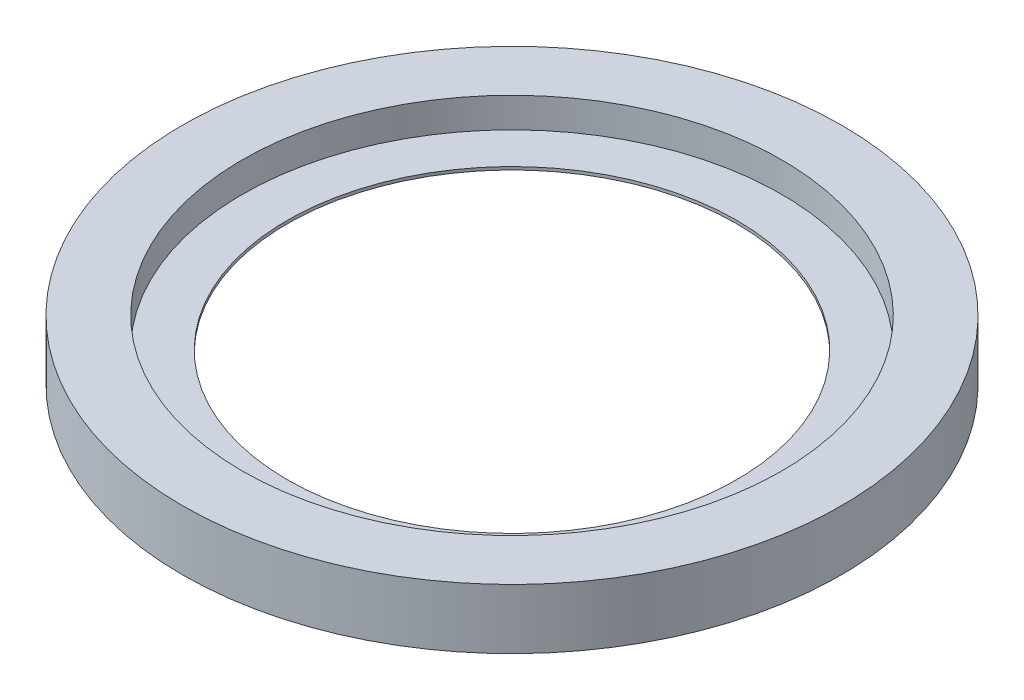
ISO-10303-21;
HEADER;
FILE_DESCRIPTION(('STEP AP214'),'2;1');
FILE_NAME('part.step','',(''),(''),'','','');
FILE_SCHEMA(('AUTOMOTIVE_DESIGN { 1 0 10303 214 1 1 1 1 }'));
ENDSEC;
DATA;
#1=APPLICATION_CONTEXT('core data for automotive mechanical design processes');
#2=APPLICATION_PROTOCOL_DEFINITION('international standard','automotive_design',2000,#1);
#3=PRODUCT_CONTEXT('',#1,'mechanical');
#4=PRODUCT('Part','Part','',(#3));
#5=PRODUCT_RELATED_PRODUCT_CATEGORY('part','',(#4));
#6=PRODUCT_DEFINITION_FORMATION('','',#4);
#7=PRODUCT_DEFINITION_CONTEXT('part definition',#1,'design');
#8=PRODUCT_DEFINITION('design','',#6,#7);
#9=PRODUCT_DEFINITION_SHAPE('','',#8);
#10=(LENGTH_UNIT() NAMED_UNIT(*) SI_UNIT(.MILLI.,.METRE.));
#11=(NAMED_UNIT(*) PLANE_ANGLE_UNIT() SI_UNIT($,.RADIAN.));
#12=(NAMED_UNIT(*) SI_UNIT($,.STERADIAN.) SOLID_ANGLE_UNIT());
#13=UNCERTAINTY_MEASURE_WITH_UNIT(LENGTH_MEASURE(1.E-05),#10,'distance_accuracy_value','');
#14=(GEOMETRIC_REPRESENTATION_CONTEXT(3) GLOBAL_UNCERTAINTY_ASSIGNED_CONTEXT((#13)) GLOBAL_UNIT_ASSIGNED_CONTEXT((#10,
#11,#12)) REPRESENTATION_CONTEXT('',''));
#15=CARTESIAN_POINT('',(0.,0.,0.));
#16=DIRECTION('',(0.,0.,1.));
#17=DIRECTION('',(1.,0.,0.));
#18=AXIS2_PLACEMENT_3D('',#15,#16,#17);
#19=CARTESIAN_POINT('',(0.,2.,0.));
#20=DIRECTION('',(0.,-1.,0.));
#21=DIRECTION('',(0.,0.,-1.));
#22=AXIS2_PLACEMENT_3D('',#19,#20,#21);
#23=CYLINDRICAL_SURFACE('',#22,9.);
#24=CARTESIAN_POINT('',(0.,0.,0.));
#25=DIRECTION('',(0.,1.,0.));
#26=DIRECTION('',(0.,0.,1.));
#27=AXIS2_PLACEMENT_3D('',#24,#25,#26);
#28=CIRCLE('',#27,9.);
#29=CARTESIAN_POINT('',(0.,0.,9.));
#30=VERTEX_POINT('',#29);
#31=EDGE_CURVE('E62',#30,#30,#28,.T.);
#32=ORIENTED_EDGE('',*,*,#31,.F.);
#33=EDGE_LOOP('',(#32));
#34=FACE_BOUND('',#33,.T.);
#35=CARTESIAN_POINT('',(0.,0.9,0.));
#36=DIRECTION('',(0.,1.,0.));
#37=DIRECTION('',(0.,0.,1.));
#38=AXIS2_PLACEMENT_3D('',#35,#36,#37);
#39=CIRCLE('',#38,9.);
#40=CARTESIAN_POINT('',(0.,0.9,9.));
#41=VERTEX_POINT('',#40);
#42=EDGE_CURVE('E66',#41,#41,#39,.T.);
#43=ORIENTED_EDGE('',*,*,#42,.T.);
#44=EDGE_LOOP('',(#43));
#45=FACE_BOUND('',#44,.T.);
#46=ADVANCED_FACE('F41',(#34,#45),#23,.F.);
#47=CARTESIAN_POINT('',(0.,2.,0.));
#48=DIRECTION('',(0.,1.,0.));
#49=DIRECTION('',(0.,0.,1.));
#50=AXIS2_PLACEMENT_3D('',#47,#48,#49);
#51=PLANE('',#50);
#52=CARTESIAN_POINT('',(0.,2.,0.));
#53=DIRECTION('',(0.,1.,0.));
#54=DIRECTION('',(0.,0.,1.));
#55=AXIS2_PLACEMENT_3D('',#52,#53,#54);
#56=CIRCLE('',#55,11.);
#57=CARTESIAN_POINT('',(0.,2.,11.));
#58=VERTEX_POINT('',#57);
#59=EDGE_CURVE('E49',#58,#58,#56,.T.);
#60=ORIENTED_EDGE('',*,*,#59,.T.);
#61=EDGE_LOOP('',(#60));
#62=FACE_BOUND('',#61,.T.);
#63=CARTESIAN_POINT('',(0.,2.,0.));
#64=DIRECTION('',(0.,1.,0.));
#65=DIRECTION('',(0.,0.,1.));
#66=AXIS2_PLACEMENT_3D('',#63,#64,#65);
#67=CIRCLE('',#66,9.);
#68=CARTESIAN_POINT('',(0.,2.,9.));
#69=VERTEX_POINT('',#68);
#70=EDGE_CURVE('E60',#69,#69,#67,.T.);
#71=ORIENTED_EDGE('',*,*,#70,.F.);
#72=EDGE_LOOP('',(#71));
#73=FACE_BOUND('',#72,.T.);
#74=ADVANCED_FACE('F101',(#62,#73),#51,.T.);
#75=CARTESIAN_POINT('',(0.,0.,0.));
#76=DIRECTION('',(0.,1.,0.));
#77=DIRECTION('',(0.,0.,1.));
#78=AXIS2_PLACEMENT_3D('',#75,#76,#77);
#79=PLANE('',#78);
#80=CARTESIAN_POINT('',(0.,0.,0.));
#81=DIRECTION('',(0.,1.,0.));
#82=DIRECTION('',(0.,0.,1.));
#83=AXIS2_PLACEMENT_3D('',#80,#81,#82);
#84=CIRCLE('',#83,11.);
#85=CARTESIAN_POINT('',(0.,0.,11.));
#86=VERTEX_POINT('',#85);
#87=EDGE_CURVE('E54',#86,#86,#84,.T.);
#88=ORIENTED_EDGE('',*,*,#87,.F.);
#89=EDGE_LOOP('',(#88));
#90=FACE_BOUND('',#89,.T.);
#91=ORIENTED_EDGE('',*,*,#31,.T.);
#92=EDGE_LOOP('',(#91));
#93=FACE_BOUND('',#92,.T.);
#94=ADVANCED_FACE('F106',(#90,#93),#79,.F.);
#95=CARTESIAN_POINT('',(0.,2.,0.));
#96=DIRECTION('',(0.,-1.,0.));
#97=DIRECTION('',(0.,0.,-1.));
#98=AXIS2_PLACEMENT_3D('',#95,#96,#97);
#99=CYLINDRICAL_SURFACE('',#98,11.);
#100=ORIENTED_EDGE('',*,*,#59,.F.);
#101=EDGE_LOOP('',(#100));
#102=FACE_BOUND('',#101,.T.);
#103=ORIENTED_EDGE('',*,*,#87,.T.);
#104=EDGE_LOOP('',(#103));
#105=FACE_BOUND('',#104,.T.);
#106=ADVANCED_FACE('F43',(#102,#105),#99,.T.);
#107=CARTESIAN_POINT('',(0.,1.,0.));
#108=DIRECTION('',(0.,1.,0.));
#109=DIRECTION('',(0.,0.,1.));
#110=AXIS2_PLACEMENT_3D('',#107,#108,#109);
#111=CIRCLE('',#110,9.);
#112=CARTESIAN_POINT('',(0.,1.,9.));
#113=VERTEX_POINT('',#112);
#114=EDGE_CURVE('E10',#113,#113,#111,.T.);
#115=ORIENTED_EDGE('',*,*,#114,.F.);
#116=EDGE_LOOP('',(#115));
#117=FACE_BOUND('',#116,.T.);
#118=ORIENTED_EDGE('',*,*,#70,.T.);
#119=EDGE_LOOP('',(#118));
#120=FACE_BOUND('',#119,.T.);
#121=ADVANCED_FACE('F97',(#117,#120),#23,.F.);
#122=CARTESIAN_POINT('',(0.,0.9,0.));
#123=DIRECTION('',(0.,1.,0.));
#124=DIRECTION('',(0.,0.,1.));
#125=AXIS2_PLACEMENT_3D('',#122,#123,#124);
#126=PLANE('',#125);
#127=CARTESIAN_POINT('',(0.,0.9,0.));
#128=DIRECTION('',(0.,1.,0.));
#129=DIRECTION('',(0.,0.,1.));
#130=AXIS2_PLACEMENT_3D('',#127,#128,#129);
#131=CIRCLE('',#130,7.5);
#132=CARTESIAN_POINT('',(0.,0.9,7.5));
#133=VERTEX_POINT('',#132);
#134=EDGE_CURVE('E73',#133,#133,#131,.T.);
#135=ORIENTED_EDGE('',*,*,#134,.T.);
#136=EDGE_LOOP('',(#135));
#137=FACE_BOUND('',#136,.T.);
#138=ORIENTED_EDGE('',*,*,#42,.F.);
#139=EDGE_LOOP('',(#138));
#140=FACE_BOUND('',#139,.T.);
#141=ADVANCED_FACE('F82',(#137,#140),#126,.F.);
#142=CARTESIAN_POINT('',(0.,1.,0.));
#143=DIRECTION('',(0.,1.,0.));
#144=DIRECTION('',(0.,0.,1.));
#145=AXIS2_PLACEMENT_3D('',#142,#143,#144);
#146=PLANE('',#145);
#147=CARTESIAN_POINT('',(0.,1.,0.));
#148=DIRECTION('',(0.,1.,0.));
#149=DIRECTION('',(0.,0.,1.));
#150=AXIS2_PLACEMENT_3D('',#147,#148,#149);
#151=CIRCLE('',#150,7.5);
#152=CARTESIAN_POINT('',(0.,1.,7.5));
#153=VERTEX_POINT('',#152);
#154=EDGE_CURVE('E74',#153,#153,#151,.T.);
#155=ORIENTED_EDGE('',*,*,#154,.F.);
#156=EDGE_LOOP('',(#155));
#157=FACE_BOUND('',#156,.T.);
#158=ORIENTED_EDGE('',*,*,#114,.T.);
#159=EDGE_LOOP('',(#158));
#160=FACE_BOUND('',#159,.T.);
#161=ADVANCED_FACE('F88',(#157,#160),#146,.T.);
#162=CARTESIAN_POINT('',(0.,0.9,0.));
#163=DIRECTION('',(0.,1.,0.));
#164=DIRECTION('',(0.,0.,1.));
#165=AXIS2_PLACEMENT_3D('',#162,#163,#164);
#166=CYLINDRICAL_SURFACE('',#165,7.5);
#167=ORIENTED_EDGE('',*,*,#134,.F.);
#168=EDGE_LOOP('',(#167));
#169=FACE_BOUND('',#168,.T.);
#170=ORIENTED_EDGE('',*,*,#154,.T.);
#171=EDGE_LOOP('',(#170));
#172=FACE_BOUND('',#171,.T.);
#173=ADVANCED_FACE('F85',(#169,#172),#166,.F.);
#174=CLOSED_SHELL('',(#46,#74,#94,#106,#121,#141,#161,#173));
#175=MANIFOLD_SOLID_BREP('B2',#174);
#176=ADVANCED_BREP_SHAPE_REPRESENTATION('',(#18,#175),#14);
#177=SHAPE_DEFINITION_REPRESENTATION(#9,#176);
ENDSEC;
END-ISO-10303-21;
